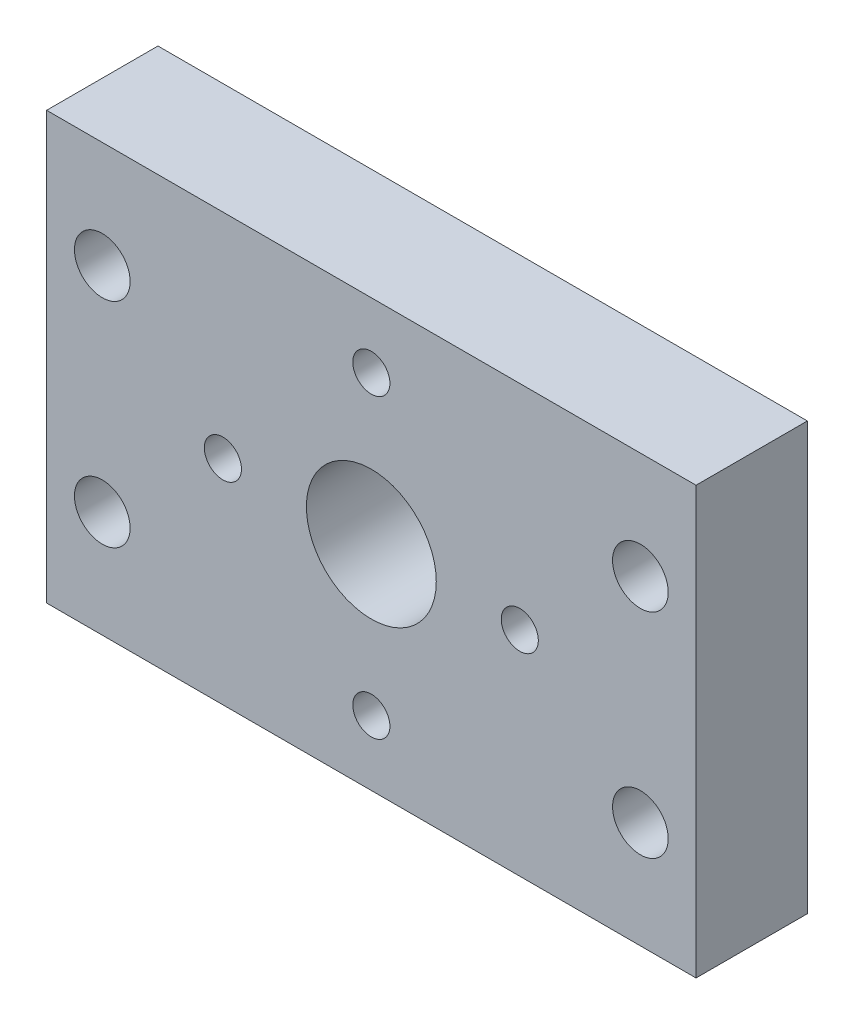
ISO-10303-21;
HEADER;
FILE_DESCRIPTION(('STEP AP214'),'2;1');
FILE_NAME('part.step','',(''),(''),'','','');
FILE_SCHEMA(('AUTOMOTIVE_DESIGN { 1 0 10303 214 1 1 1 1 }'));
ENDSEC;
DATA;
#1=APPLICATION_CONTEXT('core data for automotive mechanical design processes');
#2=APPLICATION_PROTOCOL_DEFINITION('international standard','automotive_design',2000,#1);
#3=PRODUCT_CONTEXT('',#1,'mechanical');
#4=PRODUCT('Part','Part','',(#3));
#5=PRODUCT_RELATED_PRODUCT_CATEGORY('part','',(#4));
#6=PRODUCT_DEFINITION_FORMATION('','',#4);
#7=PRODUCT_DEFINITION_CONTEXT('part definition',#1,'design');
#8=PRODUCT_DEFINITION('design','',#6,#7);
#9=PRODUCT_DEFINITION_SHAPE('','',#8);
#10=(LENGTH_UNIT() NAMED_UNIT(*) SI_UNIT(.MILLI.,.METRE.));
#11=(NAMED_UNIT(*) PLANE_ANGLE_UNIT() SI_UNIT($,.RADIAN.));
#12=(NAMED_UNIT(*) SI_UNIT($,.STERADIAN.) SOLID_ANGLE_UNIT());
#13=UNCERTAINTY_MEASURE_WITH_UNIT(LENGTH_MEASURE(1.E-05),#10,'distance_accuracy_value','');
#14=(GEOMETRIC_REPRESENTATION_CONTEXT(3) GLOBAL_UNCERTAINTY_ASSIGNED_CONTEXT((#13)) GLOBAL_UNIT_ASSIGNED_CONTEXT((#10,
#11,#12)) REPRESENTATION_CONTEXT('',''));
#15=CARTESIAN_POINT('',(0.,0.,0.));
#16=DIRECTION('',(0.,0.,1.));
#17=DIRECTION('',(1.,0.,0.));
#18=AXIS2_PLACEMENT_3D('',#15,#16,#17);
#19=CARTESIAN_POINT('',(0.,0.,6.));
#20=DIRECTION('',(0.,0.,-1.));
#21=DIRECTION('',(-1.,0.,0.));
#22=AXIS2_PLACEMENT_3D('',#19,#20,#21);
#23=PLANE('',#22);
#24=CARTESIAN_POINT('',(14.5,5.75,6.));
#25=DIRECTION('',(0.,0.,-1.));
#26=DIRECTION('',(-1.,0.,0.));
#27=AXIS2_PLACEMENT_3D('',#24,#25,#26);
#28=CIRCLE('',#27,1.5);
#29=CARTESIAN_POINT('',(13.,5.75,6.));
#30=VERTEX_POINT('',#29);
#31=EDGE_CURVE('E326',#30,#30,#28,.T.);
#32=ORIENTED_EDGE('',*,*,#31,.T.);
#33=EDGE_LOOP('',(#32));
#34=FACE_BOUND('',#33,.T.);
#35=CARTESIAN_POINT('',(-14.5,-5.75,6.));
#36=DIRECTION('',(0.,0.,-1.));
#37=DIRECTION('',(-1.,0.,0.));
#38=AXIS2_PLACEMENT_3D('',#35,#36,#37);
#39=CIRCLE('',#38,1.5);
#40=CARTESIAN_POINT('',(-16.,-5.75,6.));
#41=VERTEX_POINT('',#40);
#42=EDGE_CURVE('E320',#41,#41,#39,.T.);
#43=ORIENTED_EDGE('',*,*,#42,.T.);
#44=EDGE_LOOP('',(#43));
#45=FACE_BOUND('',#44,.T.);
#46=DIRECTION('',(-1.,0.,0.));
#47=VECTOR('',#46,1.);
#48=CARTESIAN_POINT('',(17.5,-11.5,6.));
#49=LINE('',#48,#47);
#50=CARTESIAN_POINT('',(17.5,-11.5,6.));
#51=VERTEX_POINT('',#50);
#52=CARTESIAN_POINT('',(-17.5,-11.5,6.));
#53=VERTEX_POINT('',#52);
#54=EDGE_CURVE('E229',#51,#53,#49,.T.);
#55=ORIENTED_EDGE('',*,*,#54,.F.);
#56=DIRECTION('',(0.,1.,0.));
#57=VECTOR('',#56,1.);
#58=CARTESIAN_POINT('',(17.5,-11.5,6.));
#59=LINE('',#58,#57);
#60=CARTESIAN_POINT('',(17.5,11.5,6.));
#61=VERTEX_POINT('',#60);
#62=EDGE_CURVE('E219',#51,#61,#59,.T.);
#63=ORIENTED_EDGE('',*,*,#62,.T.);
#64=DIRECTION('',(-1.,0.,0.));
#65=VECTOR('',#64,1.);
#66=CARTESIAN_POINT('',(17.5,11.5,6.));
#67=LINE('',#66,#65);
#68=CARTESIAN_POINT('',(-17.5,11.5,6.));
#69=VERTEX_POINT('',#68);
#70=EDGE_CURVE('E214',#61,#69,#67,.T.);
#71=ORIENTED_EDGE('',*,*,#70,.T.);
#72=DIRECTION('',(0.,1.,0.));
#73=VECTOR('',#72,1.);
#74=CARTESIAN_POINT('',(-17.5,-11.5,6.));
#75=LINE('',#74,#73);
#76=EDGE_CURVE('E218',#53,#69,#75,.T.);
#77=ORIENTED_EDGE('',*,*,#76,.F.);
#78=EDGE_LOOP('',(#55,#63,#71,#77));
#79=FACE_BOUND('',#78,.T.);
#80=CARTESIAN_POINT('',(0.,0.,6.));
#81=DIRECTION('',(0.,0.,1.));
#82=DIRECTION('',(1.,0.,0.));
#83=AXIS2_PLACEMENT_3D('',#80,#81,#82);
#84=CIRCLE('',#83,3.5);
#85=CARTESIAN_POINT('',(3.5,0.,6.));
#86=VERTEX_POINT('',#85);
#87=EDGE_CURVE('E239',#86,#86,#84,.T.);
#88=ORIENTED_EDGE('',*,*,#87,.F.);
#89=EDGE_LOOP('',(#88));
#90=FACE_BOUND('',#89,.T.);
#91=CARTESIAN_POINT('',(0.,8.,6.));
#92=DIRECTION('',(0.,0.,1.));
#93=DIRECTION('',(1.,0.,0.));
#94=AXIS2_PLACEMENT_3D('',#91,#92,#93);
#95=CIRCLE('',#94,1.);
#96=CARTESIAN_POINT('',(0.999999999999998,8.,6.));
#97=VERTEX_POINT('',#96);
#98=EDGE_CURVE('E284',#97,#97,#95,.T.);
#99=ORIENTED_EDGE('',*,*,#98,.F.);
#100=EDGE_LOOP('',(#99));
#101=FACE_BOUND('',#100,.T.);
#102=CARTESIAN_POINT('',(-8.,0.,6.));
#103=DIRECTION('',(0.,0.,1.));
#104=DIRECTION('',(1.,0.,0.));
#105=AXIS2_PLACEMENT_3D('',#102,#103,#104);
#106=CIRCLE('',#105,1.);
#107=CARTESIAN_POINT('',(-7.,0.,6.));
#108=VERTEX_POINT('',#107);
#109=EDGE_CURVE('E291',#108,#108,#106,.T.);
#110=ORIENTED_EDGE('',*,*,#109,.F.);
#111=EDGE_LOOP('',(#110));
#112=FACE_BOUND('',#111,.T.);
#113=CARTESIAN_POINT('',(0.,-8.,6.));
#114=DIRECTION('',(0.,0.,1.));
#115=DIRECTION('',(1.,0.,0.));
#116=AXIS2_PLACEMENT_3D('',#113,#114,#115);
#117=CIRCLE('',#116,1.);
#118=CARTESIAN_POINT('',(0.999999999999998,-8.,6.));
#119=VERTEX_POINT('',#118);
#120=EDGE_CURVE('E296',#119,#119,#117,.T.);
#121=ORIENTED_EDGE('',*,*,#120,.F.);
#122=EDGE_LOOP('',(#121));
#123=FACE_BOUND('',#122,.T.);
#124=CARTESIAN_POINT('',(8.,0.,6.));
#125=DIRECTION('',(0.,0.,1.));
#126=DIRECTION('',(1.,0.,0.));
#127=AXIS2_PLACEMENT_3D('',#124,#125,#126);
#128=CIRCLE('',#127,1.);
#129=CARTESIAN_POINT('',(9.,0.,6.));
#130=VERTEX_POINT('',#129);
#131=EDGE_CURVE('E302',#130,#130,#128,.T.);
#132=ORIENTED_EDGE('',*,*,#131,.F.);
#133=EDGE_LOOP('',(#132));
#134=FACE_BOUND('',#133,.T.);
#135=CARTESIAN_POINT('',(-14.5,5.75,6.));
#136=DIRECTION('',(0.,0.,1.));
#137=DIRECTION('',(1.,0.,0.));
#138=AXIS2_PLACEMENT_3D('',#135,#136,#137);
#139=CIRCLE('',#138,1.5);
#140=CARTESIAN_POINT('',(-13.,5.75,6.));
#141=VERTEX_POINT('',#140);
#142=EDGE_CURVE('E308',#141,#141,#139,.T.);
#143=ORIENTED_EDGE('',*,*,#142,.F.);
#144=EDGE_LOOP('',(#143));
#145=FACE_BOUND('',#144,.T.);
#146=CARTESIAN_POINT('',(14.5,-5.75,6.));
#147=DIRECTION('',(0.,0.,1.));
#148=DIRECTION('',(1.,0.,0.));
#149=AXIS2_PLACEMENT_3D('',#146,#147,#148);
#150=CIRCLE('',#149,1.5);
#151=CARTESIAN_POINT('',(16.,-5.75,6.));
#152=VERTEX_POINT('',#151);
#153=EDGE_CURVE('E314',#152,#152,#150,.T.);
#154=ORIENTED_EDGE('',*,*,#153,.F.);
#155=EDGE_LOOP('',(#154));
#156=FACE_BOUND('',#155,.T.);
#157=ADVANCED_FACE('F168',(#34,#45,#79,#90,#101,#112,#123,#134,#145,#156),#23,.F.);
#158=CARTESIAN_POINT('',(0.,0.,0.));
#159=DIRECTION('',(0.,0.,-1.));
#160=DIRECTION('',(-1.,0.,0.));
#161=AXIS2_PLACEMENT_3D('',#158,#159,#160);
#162=PLANE('',#161);
#163=CARTESIAN_POINT('',(14.5,5.75,0.));
#164=DIRECTION('',(0.,0.,-1.));
#165=DIRECTION('',(-1.,0.,0.));
#166=AXIS2_PLACEMENT_3D('',#163,#164,#165);
#167=CIRCLE('',#166,1.5);
#168=CARTESIAN_POINT('',(13.,5.75,0.));
#169=VERTEX_POINT('',#168);
#170=EDGE_CURVE('E329',#169,#169,#167,.T.);
#171=ORIENTED_EDGE('',*,*,#170,.F.);
#172=EDGE_LOOP('',(#171));
#173=FACE_BOUND('',#172,.T.);
#174=CARTESIAN_POINT('',(-14.5,-5.75,0.));
#175=DIRECTION('',(0.,0.,-1.));
#176=DIRECTION('',(-1.,0.,0.));
#177=AXIS2_PLACEMENT_3D('',#174,#175,#176);
#178=CIRCLE('',#177,1.5);
#179=CARTESIAN_POINT('',(-16.,-5.75,0.));
#180=VERTEX_POINT('',#179);
#181=EDGE_CURVE('E323',#180,#180,#178,.T.);
#182=ORIENTED_EDGE('',*,*,#181,.F.);
#183=EDGE_LOOP('',(#182));
#184=FACE_BOUND('',#183,.T.);
#185=CARTESIAN_POINT('',(-14.5,5.75,0.));
#186=DIRECTION('',(0.,0.,1.));
#187=DIRECTION('',(1.,0.,0.));
#188=AXIS2_PLACEMENT_3D('',#185,#186,#187);
#189=CIRCLE('',#188,1.5);
#190=CARTESIAN_POINT('',(-13.,5.75,0.));
#191=VERTEX_POINT('',#190);
#192=EDGE_CURVE('E311',#191,#191,#189,.T.);
#193=ORIENTED_EDGE('',*,*,#192,.T.);
#194=EDGE_LOOP('',(#193));
#195=FACE_BOUND('',#194,.T.);
#196=CARTESIAN_POINT('',(0.,-8.,0.));
#197=DIRECTION('',(0.,0.,1.));
#198=DIRECTION('',(1.,0.,0.));
#199=AXIS2_PLACEMENT_3D('',#196,#197,#198);
#200=CIRCLE('',#199,1.);
#201=CARTESIAN_POINT('',(0.999999999999998,-8.,0.));
#202=VERTEX_POINT('',#201);
#203=EDGE_CURVE('E299',#202,#202,#200,.T.);
#204=ORIENTED_EDGE('',*,*,#203,.T.);
#205=EDGE_LOOP('',(#204));
#206=FACE_BOUND('',#205,.T.);
#207=CARTESIAN_POINT('',(0.,8.,0.));
#208=DIRECTION('',(0.,0.,1.));
#209=DIRECTION('',(1.,0.,0.));
#210=AXIS2_PLACEMENT_3D('',#207,#208,#209);
#211=CIRCLE('',#210,1.);
#212=CARTESIAN_POINT('',(0.999999999999998,8.,0.));
#213=VERTEX_POINT('',#212);
#214=EDGE_CURVE('E287',#213,#213,#211,.T.);
#215=ORIENTED_EDGE('',*,*,#214,.T.);
#216=EDGE_LOOP('',(#215));
#217=FACE_BOUND('',#216,.T.);
#218=DIRECTION('',(-1.,0.,0.));
#219=VECTOR('',#218,1.);
#220=CARTESIAN_POINT('',(17.5,-11.5,0.));
#221=LINE('',#220,#219);
#222=CARTESIAN_POINT('',(17.5,-11.5,0.));
#223=VERTEX_POINT('',#222);
#224=CARTESIAN_POINT('',(-17.5,-11.5,0.));
#225=VERTEX_POINT('',#224);
#226=EDGE_CURVE('E235',#223,#225,#221,.T.);
#227=ORIENTED_EDGE('',*,*,#226,.T.);
#228=DIRECTION('',(0.,1.,0.));
#229=VECTOR('',#228,1.);
#230=CARTESIAN_POINT('',(-17.5,-11.5,0.));
#231=LINE('',#230,#229);
#232=CARTESIAN_POINT('',(-17.5,11.5,0.));
#233=VERTEX_POINT('',#232);
#234=EDGE_CURVE('E238',#225,#233,#231,.T.);
#235=ORIENTED_EDGE('',*,*,#234,.T.);
#236=DIRECTION('',(-1.,0.,0.));
#237=VECTOR('',#236,1.);
#238=CARTESIAN_POINT('',(17.5,11.5,0.));
#239=LINE('',#238,#237);
#240=CARTESIAN_POINT('',(17.5,11.5,0.));
#241=VERTEX_POINT('',#240);
#242=EDGE_CURVE('E226',#241,#233,#239,.T.);
#243=ORIENTED_EDGE('',*,*,#242,.F.);
#244=DIRECTION('',(0.,1.,0.));
#245=VECTOR('',#244,1.);
#246=CARTESIAN_POINT('',(17.5,-11.5,0.));
#247=LINE('',#246,#245);
#248=EDGE_CURVE('E202',#223,#241,#247,.T.);
#249=ORIENTED_EDGE('',*,*,#248,.F.);
#250=EDGE_LOOP('',(#227,#235,#243,#249));
#251=FACE_BOUND('',#250,.T.);
#252=CARTESIAN_POINT('',(0.,0.,0.));
#253=DIRECTION('',(0.,0.,1.));
#254=DIRECTION('',(1.,0.,0.));
#255=AXIS2_PLACEMENT_3D('',#252,#253,#254);
#256=CIRCLE('',#255,3.5);
#257=CARTESIAN_POINT('',(3.5,0.,0.));
#258=VERTEX_POINT('',#257);
#259=EDGE_CURVE('E283',#258,#258,#256,.T.);
#260=ORIENTED_EDGE('',*,*,#259,.T.);
#261=EDGE_LOOP('',(#260));
#262=FACE_BOUND('',#261,.T.);
#263=CARTESIAN_POINT('',(-8.,0.,0.));
#264=DIRECTION('',(0.,0.,1.));
#265=DIRECTION('',(1.,0.,0.));
#266=AXIS2_PLACEMENT_3D('',#263,#264,#265);
#267=CIRCLE('',#266,1.);
#268=CARTESIAN_POINT('',(-7.,0.,0.));
#269=VERTEX_POINT('',#268);
#270=EDGE_CURVE('E293',#269,#269,#267,.T.);
#271=ORIENTED_EDGE('',*,*,#270,.T.);
#272=EDGE_LOOP('',(#271));
#273=FACE_BOUND('',#272,.T.);
#274=CARTESIAN_POINT('',(8.,0.,0.));
#275=DIRECTION('',(0.,0.,1.));
#276=DIRECTION('',(1.,0.,0.));
#277=AXIS2_PLACEMENT_3D('',#274,#275,#276);
#278=CIRCLE('',#277,1.);
#279=CARTESIAN_POINT('',(9.,0.,0.));
#280=VERTEX_POINT('',#279);
#281=EDGE_CURVE('E305',#280,#280,#278,.T.);
#282=ORIENTED_EDGE('',*,*,#281,.T.);
#283=EDGE_LOOP('',(#282));
#284=FACE_BOUND('',#283,.T.);
#285=CARTESIAN_POINT('',(14.5,-5.75,0.));
#286=DIRECTION('',(0.,0.,1.));
#287=DIRECTION('',(1.,0.,0.));
#288=AXIS2_PLACEMENT_3D('',#285,#286,#287);
#289=CIRCLE('',#288,1.5);
#290=CARTESIAN_POINT('',(16.,-5.75,0.));
#291=VERTEX_POINT('',#290);
#292=EDGE_CURVE('E317',#291,#291,#289,.T.);
#293=ORIENTED_EDGE('',*,*,#292,.T.);
#294=EDGE_LOOP('',(#293));
#295=FACE_BOUND('',#294,.T.);
#296=ADVANCED_FACE('F244',(#173,#184,#195,#206,#217,#251,#262,#273,#284,#295),#162,.T.);
#297=CARTESIAN_POINT('',(17.5,-11.5,6.));
#298=DIRECTION('',(0.,-1.,0.));
#299=DIRECTION('',(0.,0.,-1.));
#300=AXIS2_PLACEMENT_3D('',#297,#298,#299);
#301=PLANE('',#300);
#302=ORIENTED_EDGE('',*,*,#226,.F.);
#303=DIRECTION('',(0.,0.,-1.));
#304=VECTOR('',#303,1.);
#305=CARTESIAN_POINT('',(17.5,-11.5,6.));
#306=LINE('',#305,#304);
#307=EDGE_CURVE('E12',#51,#223,#306,.T.);
#308=ORIENTED_EDGE('',*,*,#307,.F.);
#309=ORIENTED_EDGE('',*,*,#54,.T.);
#310=DIRECTION('',(0.,0.,-1.));
#311=VECTOR('',#310,1.);
#312=CARTESIAN_POINT('',(-17.5,-11.5,6.));
#313=LINE('',#312,#311);
#314=EDGE_CURVE('E172',#53,#225,#313,.T.);
#315=ORIENTED_EDGE('',*,*,#314,.T.);
#316=EDGE_LOOP('',(#302,#308,#309,#315));
#317=FACE_BOUND('',#316,.T.);
#318=ADVANCED_FACE('F170',(#317),#301,.T.);
#319=CARTESIAN_POINT('',(17.5,-11.5,6.));
#320=DIRECTION('',(-1.,0.,0.));
#321=DIRECTION('',(0.,0.,1.));
#322=AXIS2_PLACEMENT_3D('',#319,#320,#321);
#323=PLANE('',#322);
#324=ORIENTED_EDGE('',*,*,#248,.T.);
#325=DIRECTION('',(0.,0.,-1.));
#326=VECTOR('',#325,1.);
#327=CARTESIAN_POINT('',(17.5,11.5,6.));
#328=LINE('',#327,#326);
#329=EDGE_CURVE('E178',#61,#241,#328,.T.);
#330=ORIENTED_EDGE('',*,*,#329,.F.);
#331=ORIENTED_EDGE('',*,*,#62,.F.);
#332=ORIENTED_EDGE('',*,*,#307,.T.);
#333=EDGE_LOOP('',(#324,#330,#331,#332));
#334=FACE_BOUND('',#333,.T.);
#335=ADVANCED_FACE('F247',(#334),#323,.F.);
#336=CARTESIAN_POINT('',(17.5,11.5,6.));
#337=DIRECTION('',(0.,-1.,0.));
#338=DIRECTION('',(0.,0.,-1.));
#339=AXIS2_PLACEMENT_3D('',#336,#337,#338);
#340=PLANE('',#339);
#341=ORIENTED_EDGE('',*,*,#242,.T.);
#342=DIRECTION('',(0.,0.,-1.));
#343=VECTOR('',#342,1.);
#344=CARTESIAN_POINT('',(-17.5,11.5,6.));
#345=LINE('',#344,#343);
#346=EDGE_CURVE('E223',#69,#233,#345,.T.);
#347=ORIENTED_EDGE('',*,*,#346,.F.);
#348=ORIENTED_EDGE('',*,*,#70,.F.);
#349=ORIENTED_EDGE('',*,*,#329,.T.);
#350=EDGE_LOOP('',(#341,#347,#348,#349));
#351=FACE_BOUND('',#350,.T.);
#352=ADVANCED_FACE('F224',(#351),#340,.F.);
#353=CARTESIAN_POINT('',(-17.5,-11.5,6.));
#354=DIRECTION('',(-1.,0.,0.));
#355=DIRECTION('',(0.,0.,1.));
#356=AXIS2_PLACEMENT_3D('',#353,#354,#355);
#357=PLANE('',#356);
#358=ORIENTED_EDGE('',*,*,#234,.F.);
#359=ORIENTED_EDGE('',*,*,#314,.F.);
#360=ORIENTED_EDGE('',*,*,#76,.T.);
#361=ORIENTED_EDGE('',*,*,#346,.T.);
#362=EDGE_LOOP('',(#358,#359,#360,#361));
#363=FACE_BOUND('',#362,.T.);
#364=ADVANCED_FACE('F228',(#363),#357,.T.);
#365=CARTESIAN_POINT('',(0.,0.,6.));
#366=DIRECTION('',(0.,0.,-1.));
#367=DIRECTION('',(-1.,0.,0.));
#368=AXIS2_PLACEMENT_3D('',#365,#366,#367);
#369=CYLINDRICAL_SURFACE('',#368,3.5);
#370=ORIENTED_EDGE('',*,*,#87,.T.);
#371=EDGE_LOOP('',(#370));
#372=FACE_BOUND('',#371,.T.);
#373=ORIENTED_EDGE('',*,*,#259,.F.);
#374=EDGE_LOOP('',(#373));
#375=FACE_BOUND('',#374,.T.);
#376=ADVANCED_FACE('F263',(#372,#375),#369,.F.);
#377=CARTESIAN_POINT('',(0.,8.,6.));
#378=DIRECTION('',(0.,0.,-1.));
#379=DIRECTION('',(-1.,0.,0.));
#380=AXIS2_PLACEMENT_3D('',#377,#378,#379);
#381=CYLINDRICAL_SURFACE('',#380,1.);
#382=ORIENTED_EDGE('',*,*,#98,.T.);
#383=EDGE_LOOP('',(#382));
#384=FACE_BOUND('',#383,.T.);
#385=ORIENTED_EDGE('',*,*,#214,.F.);
#386=EDGE_LOOP('',(#385));
#387=FACE_BOUND('',#386,.T.);
#388=ADVANCED_FACE('F271',(#384,#387),#381,.F.);
#389=CARTESIAN_POINT('',(-8.,0.,6.));
#390=DIRECTION('',(0.,0.,-1.));
#391=DIRECTION('',(-1.,0.,0.));
#392=AXIS2_PLACEMENT_3D('',#389,#390,#391);
#393=CYLINDRICAL_SURFACE('',#392,1.);
#394=ORIENTED_EDGE('',*,*,#109,.T.);
#395=EDGE_LOOP('',(#394));
#396=FACE_BOUND('',#395,.T.);
#397=ORIENTED_EDGE('',*,*,#270,.F.);
#398=EDGE_LOOP('',(#397));
#399=FACE_BOUND('',#398,.T.);
#400=ADVANCED_FACE('F276',(#396,#399),#393,.F.);
#401=CARTESIAN_POINT('',(0.,-8.,6.));
#402=DIRECTION('',(0.,0.,-1.));
#403=DIRECTION('',(-1.,0.,0.));
#404=AXIS2_PLACEMENT_3D('',#401,#402,#403);
#405=CYLINDRICAL_SURFACE('',#404,1.);
#406=ORIENTED_EDGE('',*,*,#120,.T.);
#407=EDGE_LOOP('',(#406));
#408=FACE_BOUND('',#407,.T.);
#409=ORIENTED_EDGE('',*,*,#203,.F.);
#410=EDGE_LOOP('',(#409));
#411=FACE_BOUND('',#410,.T.);
#412=ADVANCED_FACE('F350',(#408,#411),#405,.F.);
#413=CARTESIAN_POINT('',(8.,0.,6.));
#414=DIRECTION('',(0.,0.,-1.));
#415=DIRECTION('',(-1.,0.,0.));
#416=AXIS2_PLACEMENT_3D('',#413,#414,#415);
#417=CYLINDRICAL_SURFACE('',#416,1.);
#418=ORIENTED_EDGE('',*,*,#131,.T.);
#419=EDGE_LOOP('',(#418));
#420=FACE_BOUND('',#419,.T.);
#421=ORIENTED_EDGE('',*,*,#281,.F.);
#422=EDGE_LOOP('',(#421));
#423=FACE_BOUND('',#422,.T.);
#424=ADVANCED_FACE('F352',(#420,#423),#417,.F.);
#425=CARTESIAN_POINT('',(-14.5,5.75,6.));
#426=DIRECTION('',(0.,0.,-1.));
#427=DIRECTION('',(-1.,0.,0.));
#428=AXIS2_PLACEMENT_3D('',#425,#426,#427);
#429=CYLINDRICAL_SURFACE('',#428,1.5);
#430=ORIENTED_EDGE('',*,*,#142,.T.);
#431=EDGE_LOOP('',(#430));
#432=FACE_BOUND('',#431,.T.);
#433=ORIENTED_EDGE('',*,*,#192,.F.);
#434=EDGE_LOOP('',(#433));
#435=FACE_BOUND('',#434,.T.);
#436=ADVANCED_FACE('F359',(#432,#435),#429,.F.);
#437=CARTESIAN_POINT('',(14.5,-5.75,6.));
#438=DIRECTION('',(0.,0.,-1.));
#439=DIRECTION('',(-1.,0.,0.));
#440=AXIS2_PLACEMENT_3D('',#437,#438,#439);
#441=CYLINDRICAL_SURFACE('',#440,1.5);
#442=ORIENTED_EDGE('',*,*,#153,.T.);
#443=EDGE_LOOP('',(#442));
#444=FACE_BOUND('',#443,.T.);
#445=ORIENTED_EDGE('',*,*,#292,.F.);
#446=EDGE_LOOP('',(#445));
#447=FACE_BOUND('',#446,.T.);
#448=ADVANCED_FACE('F367',(#444,#447),#441,.F.);
#449=CARTESIAN_POINT('',(-14.5,-5.75,6.));
#450=DIRECTION('',(0.,0.,-1.));
#451=DIRECTION('',(-1.,0.,0.));
#452=AXIS2_PLACEMENT_3D('',#449,#450,#451);
#453=CYLINDRICAL_SURFACE('',#452,1.5);
#454=ORIENTED_EDGE('',*,*,#42,.F.);
#455=EDGE_LOOP('',(#454));
#456=FACE_BOUND('',#455,.T.);
#457=ORIENTED_EDGE('',*,*,#181,.T.);
#458=EDGE_LOOP('',(#457));
#459=FACE_BOUND('',#458,.T.);
#460=ADVANCED_FACE('F337',(#456,#459),#453,.F.);
#461=CARTESIAN_POINT('',(14.5,5.75,6.));
#462=DIRECTION('',(0.,0.,-1.));
#463=DIRECTION('',(-1.,0.,0.));
#464=AXIS2_PLACEMENT_3D('',#461,#462,#463);
#465=CYLINDRICAL_SURFACE('',#464,1.5);
#466=ORIENTED_EDGE('',*,*,#31,.F.);
#467=EDGE_LOOP('',(#466));
#468=FACE_BOUND('',#467,.T.);
#469=ORIENTED_EDGE('',*,*,#170,.T.);
#470=EDGE_LOOP('',(#469));
#471=FACE_BOUND('',#470,.T.);
#472=ADVANCED_FACE('F334',(#468,#471),#465,.F.);
#473=CLOSED_SHELL('',(#157,#296,#318,#335,#352,#364,#376,#388,#400,#412,#424,#436,#448,#460,#472));
#474=MANIFOLD_SOLID_BREP('B2',#473);
#475=ADVANCED_BREP_SHAPE_REPRESENTATION('',(#18,#474),#14);
#476=SHAPE_DEFINITION_REPRESENTATION(#9,#475);
ENDSEC;
END-ISO-10303-21;
